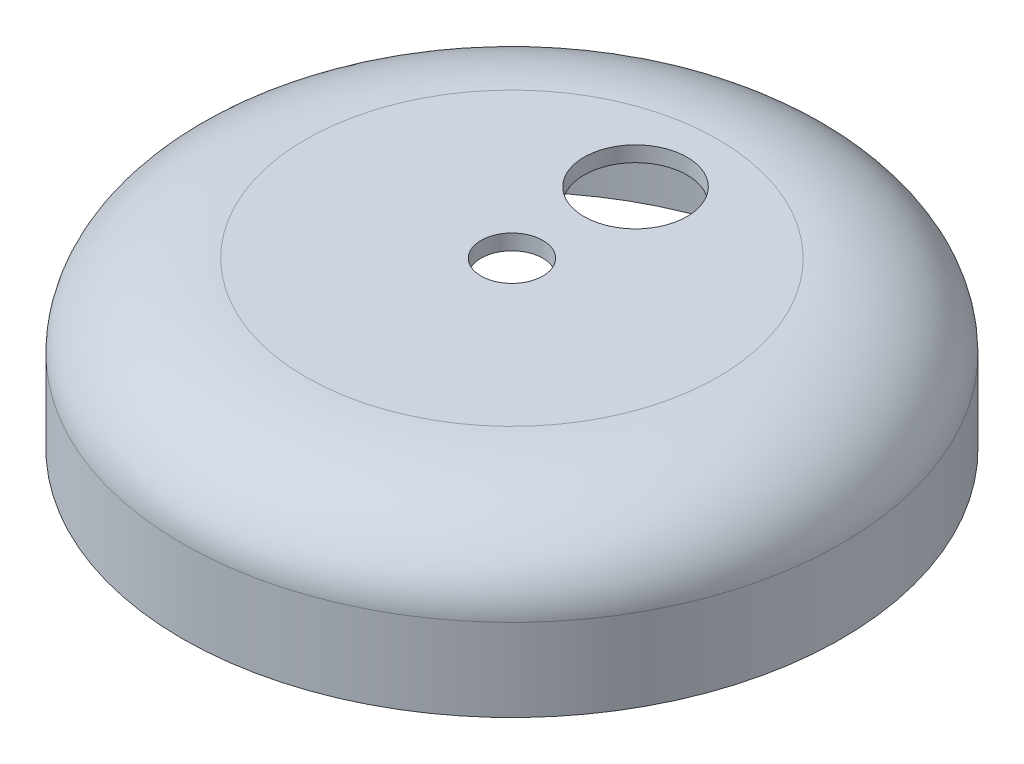
ISO-10303-21;
HEADER;
FILE_DESCRIPTION(('STEP AP214'),'2;1');
FILE_NAME('part.step','',(''),(''),'','','');
FILE_SCHEMA(('AUTOMOTIVE_DESIGN { 1 0 10303 214 1 1 1 1 }'));
ENDSEC;
DATA;
#1=APPLICATION_CONTEXT('core data for automotive mechanical design processes');
#2=APPLICATION_PROTOCOL_DEFINITION('international standard','automotive_design',2000,#1);
#3=PRODUCT_CONTEXT('',#1,'mechanical');
#4=PRODUCT('Part','Part','',(#3));
#5=PRODUCT_RELATED_PRODUCT_CATEGORY('part','',(#4));
#6=PRODUCT_DEFINITION_FORMATION('','',#4);
#7=PRODUCT_DEFINITION_CONTEXT('part definition',#1,'design');
#8=PRODUCT_DEFINITION('design','',#6,#7);
#9=PRODUCT_DEFINITION_SHAPE('','',#8);
#10=(LENGTH_UNIT() NAMED_UNIT(*) SI_UNIT(.MILLI.,.METRE.));
#11=(NAMED_UNIT(*) PLANE_ANGLE_UNIT() SI_UNIT($,.RADIAN.));
#12=(NAMED_UNIT(*) SI_UNIT($,.STERADIAN.) SOLID_ANGLE_UNIT());
#13=UNCERTAINTY_MEASURE_WITH_UNIT(LENGTH_MEASURE(1.E-05),#10,'distance_accuracy_value','');
#14=(GEOMETRIC_REPRESENTATION_CONTEXT(3) GLOBAL_UNCERTAINTY_ASSIGNED_CONTEXT((#13)) GLOBAL_UNIT_ASSIGNED_CONTEXT((#10,
#11,#12)) REPRESENTATION_CONTEXT('',''));
#15=CARTESIAN_POINT('',(0.,0.,0.));
#16=DIRECTION('',(0.,0.,1.));
#17=DIRECTION('',(1.,0.,0.));
#18=AXIS2_PLACEMENT_3D('',#15,#16,#17);
#19=CARTESIAN_POINT('',(0.,0.,0.));
#20=DIRECTION('',(0.,-1.,0.));
#21=DIRECTION('',(0.,0.,-1.));
#22=AXIS2_PLACEMENT_3D('',#19,#20,#21);
#23=PLANE('',#22);
#24=CARTESIAN_POINT('',(0.,0.,-38.1));
#25=DIRECTION('',(0.,1.,0.));
#26=DIRECTION('',(0.,0.,1.));
#27=AXIS2_PLACEMENT_3D('',#24,#25,#26);
#28=CIRCLE('',#27,15.875);
#29=CARTESIAN_POINT('',(0.,0.,-22.225));
#30=VERTEX_POINT('',#29);
#31=EDGE_CURVE('E47',#30,#30,#28,.T.);
#32=ORIENTED_EDGE('',*,*,#31,.F.);
#33=EDGE_LOOP('',(#32));
#34=FACE_BOUND('',#33,.T.);
#35=CARTESIAN_POINT('',(0.,0.,0.));
#36=DIRECTION('',(0.,1.,0.));
#37=DIRECTION('',(0.,0.,1.));
#38=AXIS2_PLACEMENT_3D('',#35,#36,#37);
#39=CIRCLE('',#38,9.525);
#40=CARTESIAN_POINT('',(0.,0.,9.525));
#41=VERTEX_POINT('',#40);
#42=EDGE_CURVE('E53',#41,#41,#39,.T.);
#43=ORIENTED_EDGE('',*,*,#42,.F.);
#44=EDGE_LOOP('',(#43));
#45=FACE_BOUND('',#44,.T.);
#46=CARTESIAN_POINT('',(0.,0.,0.));
#47=DIRECTION('',(0.,1.,0.));
#48=DIRECTION('',(0.,0.,1.));
#49=AXIS2_PLACEMENT_3D('',#46,#47,#48);
#50=CIRCLE('',#49,63.5);
#51=CARTESIAN_POINT('',(0.,0.,63.5));
#52=VERTEX_POINT('',#51);
#53=EDGE_CURVE('E10',#52,#52,#50,.T.);
#54=ORIENTED_EDGE('',*,*,#53,.T.);
#55=EDGE_LOOP('',(#54));
#56=FACE_BOUND('',#55,.T.);
#57=ADVANCED_FACE('F30',(#34,#45,#56),#23,.F.);
#58=CARTESIAN_POINT('',(63.5,-25.4,0.));
#59=DIRECTION('',(0.,0.,1.));
#60=DIRECTION('',(-1.,0.,0.));
#61=AXIS2_PLACEMENT_3D('',#58,#59,#60);
#62=ELLIPSE('',#61,38.1,25.4);
#63=CARTESIAN_POINT('',(0.,29.511089747257,0.));
#64=DIRECTION('',(0.,1.,0.));
#65=AXIS1_PLACEMENT('',#63,#64);
#66=SURFACE_OF_REVOLUTION('',#62,#65);
#67=ORIENTED_EDGE('',*,*,#53,.F.);
#68=EDGE_LOOP('',(#67));
#69=FACE_BOUND('',#68,.T.);
#70=CARTESIAN_POINT('',(0.,-25.4,0.));
#71=DIRECTION('',(0.,1.,0.));
#72=DIRECTION('',(0.,0.,1.));
#73=AXIS2_PLACEMENT_3D('',#70,#71,#72);
#74=CIRCLE('',#73,101.6);
#75=CARTESIAN_POINT('',(0.,-25.4,101.6));
#76=VERTEX_POINT('',#75);
#77=EDGE_CURVE('E37',#76,#76,#74,.T.);
#78=ORIENTED_EDGE('',*,*,#77,.T.);
#79=EDGE_LOOP('',(#78));
#80=FACE_BOUND('',#79,.T.);
#81=ADVANCED_FACE('F82',(#69,#80),#66,.T.);
#82=CARTESIAN_POINT('',(0.,29.511089747257,0.));
#83=DIRECTION('',(0.,1.,0.));
#84=DIRECTION('',(0.,0.,1.));
#85=AXIS2_PLACEMENT_3D('',#82,#83,#84);
#86=CYLINDRICAL_SURFACE('',#85,101.6);
#87=ORIENTED_EDGE('',*,*,#77,.F.);
#88=EDGE_LOOP('',(#87));
#89=FACE_BOUND('',#88,.T.);
#90=CARTESIAN_POINT('',(0.,-50.8,0.));
#91=DIRECTION('',(0.,1.,0.));
#92=DIRECTION('',(0.,0.,1.));
#93=AXIS2_PLACEMENT_3D('',#90,#91,#92);
#94=CIRCLE('',#93,101.6);
#95=CARTESIAN_POINT('',(0.,-50.8,101.6));
#96=VERTEX_POINT('',#95);
#97=EDGE_CURVE('E42',#96,#96,#94,.T.);
#98=ORIENTED_EDGE('',*,*,#97,.T.);
#99=EDGE_LOOP('',(#98));
#100=FACE_BOUND('',#99,.T.);
#101=ADVANCED_FACE('F79',(#89,#100),#86,.T.);
#102=CARTESIAN_POINT('',(96.8375,-50.8,0.));
#103=DIRECTION('',(0.,1.,0.));
#104=DIRECTION('',(0.,0.,1.));
#105=AXIS2_PLACEMENT_3D('',#102,#103,#104);
#106=PLANE('',#105);
#107=ORIENTED_EDGE('',*,*,#97,.F.);
#108=EDGE_LOOP('',(#107));
#109=FACE_BOUND('',#108,.T.);
#110=CARTESIAN_POINT('',(0.,-50.8,0.));
#111=DIRECTION('',(0.,1.,0.));
#112=DIRECTION('',(0.,0.,1.));
#113=AXIS2_PLACEMENT_3D('',#110,#111,#112);
#114=CIRCLE('',#113,96.8375);
#115=CARTESIAN_POINT('',(0.,-50.8,96.8375));
#116=VERTEX_POINT('',#115);
#117=EDGE_CURVE('E95',#116,#116,#114,.T.);
#118=ORIENTED_EDGE('',*,*,#117,.T.);
#119=EDGE_LOOP('',(#118));
#120=FACE_BOUND('',#119,.T.);
#121=ADVANCED_FACE('F75',(#109,#120),#106,.F.);
#122=CARTESIAN_POINT('',(0.,29.511089747257,0.));
#123=DIRECTION('',(0.,1.,0.));
#124=DIRECTION('',(0.,0.,1.));
#125=AXIS2_PLACEMENT_3D('',#122,#123,#124);
#126=CYLINDRICAL_SURFACE('',#125,96.8375);
#127=ORIENTED_EDGE('',*,*,#117,.F.);
#128=EDGE_LOOP('',(#127));
#129=FACE_BOUND('',#128,.T.);
#130=CARTESIAN_POINT('',(0.,-25.4,0.));
#131=DIRECTION('',(0.,1.,0.));
#132=DIRECTION('',(0.,0.,1.));
#133=AXIS2_PLACEMENT_3D('',#130,#131,#132);
#134=CIRCLE('',#133,96.8375);
#135=CARTESIAN_POINT('',(0.,-25.4,96.8375));
#136=VERTEX_POINT('',#135);
#137=EDGE_CURVE('E97',#136,#136,#134,.T.);
#138=ORIENTED_EDGE('',*,*,#137,.T.);
#139=EDGE_LOOP('',(#138));
#140=FACE_BOUND('',#139,.T.);
#141=ADVANCED_FACE('F70',(#129,#140),#126,.F.);
#142=CARTESIAN_POINT('',(63.5,-25.4,0.));
#143=DIRECTION('',(0.,0.,-1.));
#144=DIRECTION('',(1.,0.,0.));
#145=AXIS2_PLACEMENT_3D('',#142,#143,#144);
#146=ELLIPSE('',#145,33.3375,20.6375);
#147=CARTESIAN_POINT('',(0.,29.511089747257,0.));
#148=DIRECTION('',(0.,1.,0.));
#149=AXIS1_PLACEMENT('',#147,#148);
#150=SURFACE_OF_REVOLUTION('',#146,#149);
#151=ORIENTED_EDGE('',*,*,#137,.F.);
#152=EDGE_LOOP('',(#151));
#153=FACE_BOUND('',#152,.T.);
#154=CARTESIAN_POINT('',(0.,-4.7625,0.));
#155=DIRECTION('',(0.,1.,0.));
#156=DIRECTION('',(0.,0.,1.));
#157=AXIS2_PLACEMENT_3D('',#154,#155,#156);
#158=CIRCLE('',#157,63.5);
#159=CARTESIAN_POINT('',(0.,-4.7625,63.5));
#160=VERTEX_POINT('',#159);
#161=EDGE_CURVE('E51',#160,#160,#158,.T.);
#162=ORIENTED_EDGE('',*,*,#161,.T.);
#163=EDGE_LOOP('',(#162));
#164=FACE_BOUND('',#163,.T.);
#165=ADVANCED_FACE('F65',(#153,#164),#150,.T.);
#166=CARTESIAN_POINT('',(0.,-4.7625,0.));
#167=DIRECTION('',(0.,1.,0.));
#168=DIRECTION('',(0.,0.,1.));
#169=AXIS2_PLACEMENT_3D('',#166,#167,#168);
#170=PLANE('',#169);
#171=CARTESIAN_POINT('',(0.,-4.7625,-38.1));
#172=DIRECTION('',(0.,1.,0.));
#173=DIRECTION('',(0.,0.,1.));
#174=AXIS2_PLACEMENT_3D('',#171,#172,#173);
#175=CIRCLE('',#174,15.875);
#176=CARTESIAN_POINT('',(0.,-4.7625,-22.225));
#177=VERTEX_POINT('',#176);
#178=EDGE_CURVE('E33',#177,#177,#175,.T.);
#179=ORIENTED_EDGE('',*,*,#178,.T.);
#180=EDGE_LOOP('',(#179));
#181=FACE_BOUND('',#180,.T.);
#182=CARTESIAN_POINT('',(0.,-4.7625,0.));
#183=DIRECTION('',(0.,1.,0.));
#184=DIRECTION('',(0.,0.,1.));
#185=AXIS2_PLACEMENT_3D('',#182,#183,#184);
#186=CIRCLE('',#185,9.525);
#187=CARTESIAN_POINT('',(0.,-4.7625,9.525));
#188=VERTEX_POINT('',#187);
#189=EDGE_CURVE('E45',#188,#188,#186,.T.);
#190=ORIENTED_EDGE('',*,*,#189,.T.);
#191=EDGE_LOOP('',(#190));
#192=FACE_BOUND('',#191,.T.);
#193=ORIENTED_EDGE('',*,*,#161,.F.);
#194=EDGE_LOOP('',(#193));
#195=FACE_BOUND('',#194,.T.);
#196=ADVANCED_FACE('F69',(#181,#192,#195),#170,.F.);
#197=CARTESIAN_POINT('',(0.,-25.4,0.));
#198=DIRECTION('',(0.,1.,0.));
#199=DIRECTION('',(0.,0.,1.));
#200=AXIS2_PLACEMENT_3D('',#197,#198,#199);
#201=CYLINDRICAL_SURFACE('',#200,9.525);
#202=ORIENTED_EDGE('',*,*,#42,.T.);
#203=EDGE_LOOP('',(#202));
#204=FACE_BOUND('',#203,.T.);
#205=ORIENTED_EDGE('',*,*,#189,.F.);
#206=EDGE_LOOP('',(#205));
#207=FACE_BOUND('',#206,.T.);
#208=ADVANCED_FACE('F106',(#204,#207),#201,.F.);
#209=CARTESIAN_POINT('',(0.,-25.4,-38.1));
#210=DIRECTION('',(0.,1.,0.));
#211=DIRECTION('',(0.,0.,1.));
#212=AXIS2_PLACEMENT_3D('',#209,#210,#211);
#213=CYLINDRICAL_SURFACE('',#212,15.875);
#214=ORIENTED_EDGE('',*,*,#31,.T.);
#215=EDGE_LOOP('',(#214));
#216=FACE_BOUND('',#215,.T.);
#217=ORIENTED_EDGE('',*,*,#178,.F.);
#218=EDGE_LOOP('',(#217));
#219=FACE_BOUND('',#218,.T.);
#220=ADVANCED_FACE('F111',(#216,#219),#213,.F.);
#221=CLOSED_SHELL('',(#57,#81,#101,#121,#141,#165,#196,#208,#220));
#222=MANIFOLD_SOLID_BREP('B2',#221);
#223=ADVANCED_BREP_SHAPE_REPRESENTATION('',(#18,#222),#14);
#224=SHAPE_DEFINITION_REPRESENTATION(#9,#223);
ENDSEC;
END-ISO-10303-21;
